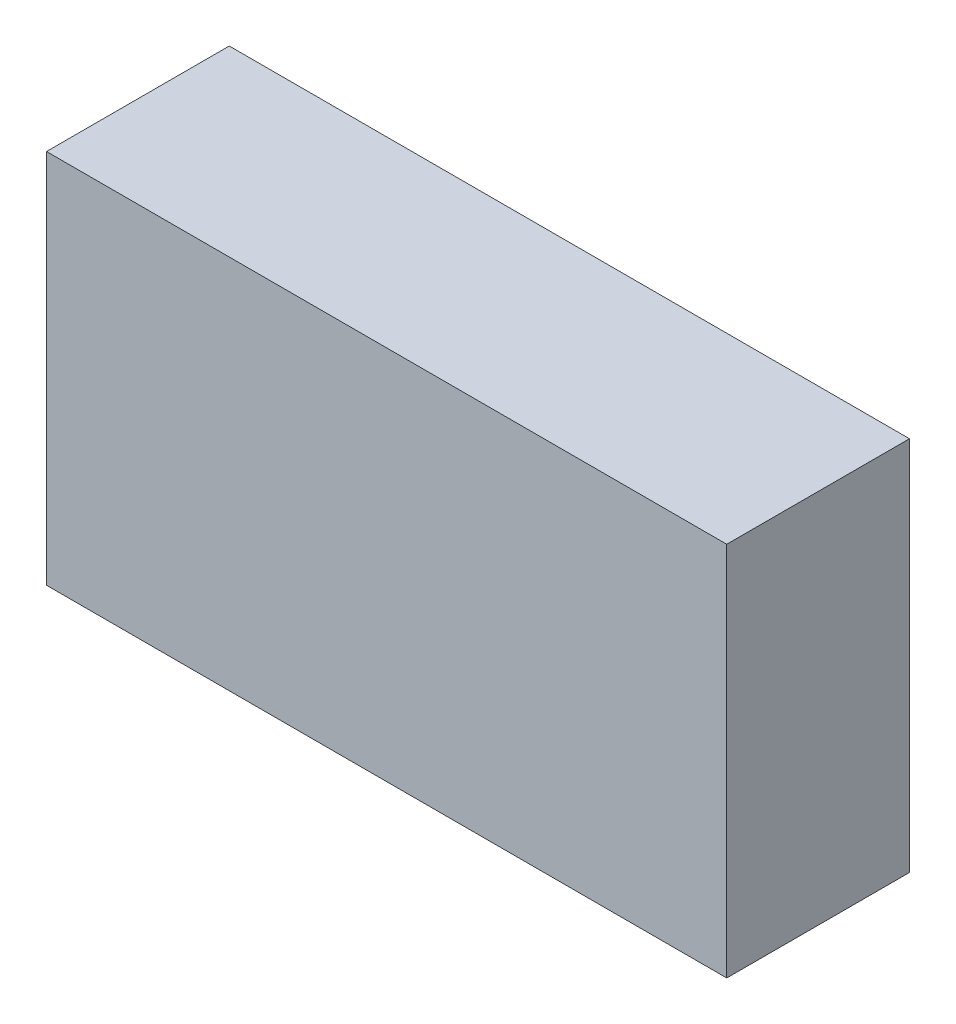
ISO-10303-21;
HEADER;
FILE_DESCRIPTION(('STEP AP214'),'2;1');
FILE_NAME('part.step','',(''),(''),'','','');
FILE_SCHEMA(('AUTOMOTIVE_DESIGN { 1 0 10303 214 1 1 1 1 }'));
ENDSEC;
DATA;
#1=APPLICATION_CONTEXT('core data for automotive mechanical design processes');
#2=APPLICATION_PROTOCOL_DEFINITION('international standard','automotive_design',2000,#1);
#3=PRODUCT_CONTEXT('',#1,'mechanical');
#4=PRODUCT('Part','Part','',(#3));
#5=PRODUCT_RELATED_PRODUCT_CATEGORY('part','',(#4));
#6=PRODUCT_DEFINITION_FORMATION('','',#4);
#7=PRODUCT_DEFINITION_CONTEXT('part definition',#1,'design');
#8=PRODUCT_DEFINITION('design','',#6,#7);
#9=PRODUCT_DEFINITION_SHAPE('','',#8);
#10=(LENGTH_UNIT() NAMED_UNIT(*) SI_UNIT(.MILLI.,.METRE.));
#11=(NAMED_UNIT(*) PLANE_ANGLE_UNIT() SI_UNIT($,.RADIAN.));
#12=(NAMED_UNIT(*) SI_UNIT($,.STERADIAN.) SOLID_ANGLE_UNIT());
#13=UNCERTAINTY_MEASURE_WITH_UNIT(LENGTH_MEASURE(1.E-05),#10,'distance_accuracy_value','');
#14=(GEOMETRIC_REPRESENTATION_CONTEXT(3) GLOBAL_UNCERTAINTY_ASSIGNED_CONTEXT((#13)) GLOBAL_UNIT_ASSIGNED_CONTEXT((#10,
#11,#12)) REPRESENTATION_CONTEXT('',''));
#15=CARTESIAN_POINT('',(0.,0.,0.));
#16=DIRECTION('',(0.,0.,1.));
#17=DIRECTION('',(1.,0.,0.));
#18=AXIS2_PLACEMENT_3D('',#15,#16,#17);
#19=CARTESIAN_POINT('',(3.35000092,1.84999884,1.79999894));
#20=DIRECTION('',(0.,0.,1.));
#21=DIRECTION('',(1.,0.,0.));
#22=AXIS2_PLACEMENT_3D('',#19,#20,#21);
#23=PLANE('',#22);
#24=DIRECTION('',(1.,0.,0.));
#25=VECTOR('',#24,1.);
#26=CARTESIAN_POINT('',(3.35000092,-1.84999884,1.79999894));
#27=LINE('',#26,#25);
#28=CARTESIAN_POINT('',(3.35000092,-1.84999884,1.79999894));
#29=VERTEX_POINT('',#28);
#30=CARTESIAN_POINT('',(-3.35000092,-1.84999884,1.79999894));
#31=VERTEX_POINT('',#30);
#32=EDGE_CURVE('E53',#29,#31,#27,.F.);
#33=ORIENTED_EDGE('',*,*,#32,.F.);
#34=DIRECTION('',(0.,1.,0.));
#35=VECTOR('',#34,1.);
#36=CARTESIAN_POINT('',(3.35000092,1.84999884,1.79999894));
#37=LINE('',#36,#35);
#38=CARTESIAN_POINT('',(3.35000092,1.84999884,1.79999894));
#39=VERTEX_POINT('',#38);
#40=EDGE_CURVE('E68',#39,#29,#37,.F.);
#41=ORIENTED_EDGE('',*,*,#40,.F.);
#42=DIRECTION('',(1.,0.,0.));
#43=VECTOR('',#42,1.);
#44=CARTESIAN_POINT('',(-3.35000092,1.84999884,1.79999894));
#45=LINE('',#44,#43);
#46=CARTESIAN_POINT('',(-3.35000092,1.84999884,1.79999894));
#47=VERTEX_POINT('',#46);
#48=EDGE_CURVE('E20',#47,#39,#45,.T.);
#49=ORIENTED_EDGE('',*,*,#48,.F.);
#50=DIRECTION('',(0.,1.,0.));
#51=VECTOR('',#50,1.);
#52=CARTESIAN_POINT('',(-3.35000092,-1.84999884,1.79999894));
#53=LINE('',#52,#51);
#54=EDGE_CURVE('E58',#31,#47,#53,.T.);
#55=ORIENTED_EDGE('',*,*,#54,.F.);
#56=EDGE_LOOP('',(#33,#41,#49,#55));
#57=FACE_BOUND('',#56,.T.);
#58=ADVANCED_FACE('F17',(#57),#23,.T.);
#59=CARTESIAN_POINT('',(-3.35000092,1.84999884,0.));
#60=DIRECTION('',(0.,1.,0.));
#61=DIRECTION('',(0.,0.,1.));
#62=AXIS2_PLACEMENT_3D('',#59,#60,#61);
#63=PLANE('',#62);
#64=DIRECTION('',(0.,0.,-1.));
#65=VECTOR('',#64,1.);
#66=CARTESIAN_POINT('',(3.35000092,1.84999884,0.));
#67=LINE('',#66,#65);
#68=CARTESIAN_POINT('',(3.35000092,1.84999884,0.));
#69=VERTEX_POINT('',#68);
#70=EDGE_CURVE('E79',#69,#39,#67,.F.);
#71=ORIENTED_EDGE('',*,*,#70,.F.);
#72=DIRECTION('',(1.,0.,0.));
#73=VECTOR('',#72,1.);
#74=CARTESIAN_POINT('',(3.35000092,1.84999884,0.));
#75=LINE('',#74,#73);
#76=CARTESIAN_POINT('',(-3.35000092,1.84999884,0.));
#77=VERTEX_POINT('',#76);
#78=EDGE_CURVE('E74',#69,#77,#75,.F.);
#79=ORIENTED_EDGE('',*,*,#78,.T.);
#80=DIRECTION('',(0.,0.,1.));
#81=VECTOR('',#80,1.);
#82=CARTESIAN_POINT('',(-3.35000092,1.84999884,0.));
#83=LINE('',#82,#81);
#84=EDGE_CURVE('E63',#47,#77,#83,.F.);
#85=ORIENTED_EDGE('',*,*,#84,.F.);
#86=ORIENTED_EDGE('',*,*,#48,.T.);
#87=EDGE_LOOP('',(#71,#79,#85,#86));
#88=FACE_BOUND('',#87,.T.);
#89=ADVANCED_FACE('F73',(#88),#63,.T.);
#90=CARTESIAN_POINT('',(-3.35000092,-1.84999884,0.));
#91=DIRECTION('',(-1.,0.,0.));
#92=DIRECTION('',(0.,0.,1.));
#93=AXIS2_PLACEMENT_3D('',#90,#91,#92);
#94=PLANE('',#93);
#95=ORIENTED_EDGE('',*,*,#84,.T.);
#96=DIRECTION('',(0.,1.,0.));
#97=VECTOR('',#96,1.);
#98=CARTESIAN_POINT('',(-3.35000092,1.84999884,0.));
#99=LINE('',#98,#97);
#100=CARTESIAN_POINT('',(-3.35000092,-1.84999884,0.));
#101=VERTEX_POINT('',#100);
#102=EDGE_CURVE('E84',#77,#101,#99,.F.);
#103=ORIENTED_EDGE('',*,*,#102,.T.);
#104=DIRECTION('',(0.,0.,-1.));
#105=VECTOR('',#104,1.);
#106=CARTESIAN_POINT('',(-3.35000092,-1.84999884,0.));
#107=LINE('',#106,#105);
#108=EDGE_CURVE('E65',#31,#101,#107,.T.);
#109=ORIENTED_EDGE('',*,*,#108,.F.);
#110=ORIENTED_EDGE('',*,*,#54,.T.);
#111=EDGE_LOOP('',(#95,#103,#109,#110));
#112=FACE_BOUND('',#111,.T.);
#113=ADVANCED_FACE('F60',(#112),#94,.T.);
#114=CARTESIAN_POINT('',(3.35000092,-1.84999884,0.));
#115=DIRECTION('',(0.,-1.,0.));
#116=DIRECTION('',(0.,0.,-1.));
#117=AXIS2_PLACEMENT_3D('',#114,#115,#116);
#118=PLANE('',#117);
#119=ORIENTED_EDGE('',*,*,#108,.T.);
#120=DIRECTION('',(1.,0.,0.));
#121=VECTOR('',#120,1.);
#122=CARTESIAN_POINT('',(3.35000092,-1.84999884,0.));
#123=LINE('',#122,#121);
#124=CARTESIAN_POINT('',(3.35000092,-1.84999884,0.));
#125=VERTEX_POINT('',#124);
#126=EDGE_CURVE('E26',#101,#125,#123,.T.);
#127=ORIENTED_EDGE('',*,*,#126,.T.);
#128=DIRECTION('',(0.,0.,-1.));
#129=VECTOR('',#128,1.);
#130=CARTESIAN_POINT('',(3.35000092,-1.84999884,0.));
#131=LINE('',#130,#129);
#132=EDGE_CURVE('E34',#29,#125,#131,.T.);
#133=ORIENTED_EDGE('',*,*,#132,.F.);
#134=ORIENTED_EDGE('',*,*,#32,.T.);
#135=EDGE_LOOP('',(#119,#127,#133,#134));
#136=FACE_BOUND('',#135,.T.);
#137=ADVANCED_FACE('F88',(#136),#118,.T.);
#138=CARTESIAN_POINT('',(3.35000092,1.84999884,0.));
#139=DIRECTION('',(1.,0.,0.));
#140=DIRECTION('',(0.,0.,-1.));
#141=AXIS2_PLACEMENT_3D('',#138,#139,#140);
#142=PLANE('',#141);
#143=ORIENTED_EDGE('',*,*,#132,.T.);
#144=DIRECTION('',(0.,1.,0.));
#145=VECTOR('',#144,1.);
#146=CARTESIAN_POINT('',(3.35000092,1.84999884,0.));
#147=LINE('',#146,#145);
#148=EDGE_CURVE('E11',#125,#69,#147,.T.);
#149=ORIENTED_EDGE('',*,*,#148,.T.);
#150=ORIENTED_EDGE('',*,*,#70,.T.);
#151=ORIENTED_EDGE('',*,*,#40,.T.);
#152=EDGE_LOOP('',(#143,#149,#150,#151));
#153=FACE_BOUND('',#152,.T.);
#154=ADVANCED_FACE('F91',(#153),#142,.T.);
#155=CARTESIAN_POINT('',(3.35000092,1.84999884,0.));
#156=DIRECTION('',(0.,0.,1.));
#157=DIRECTION('',(1.,0.,0.));
#158=AXIS2_PLACEMENT_3D('',#155,#156,#157);
#159=PLANE('',#158);
#160=ORIENTED_EDGE('',*,*,#126,.F.);
#161=ORIENTED_EDGE('',*,*,#102,.F.);
#162=ORIENTED_EDGE('',*,*,#78,.F.);
#163=ORIENTED_EDGE('',*,*,#148,.F.);
#164=EDGE_LOOP('',(#160,#161,#162,#163));
#165=FACE_BOUND('',#164,.T.);
#166=ADVANCED_FACE('F90',(#165),#159,.F.);
#167=CLOSED_SHELL('',(#58,#89,#113,#137,#154,#166));
#168=MANIFOLD_SOLID_BREP('B1',#167);
#169=ADVANCED_BREP_SHAPE_REPRESENTATION('',(#18,#168),#14);
#170=SHAPE_DEFINITION_REPRESENTATION(#9,#169);
ENDSEC;
END-ISO-10303-21;
